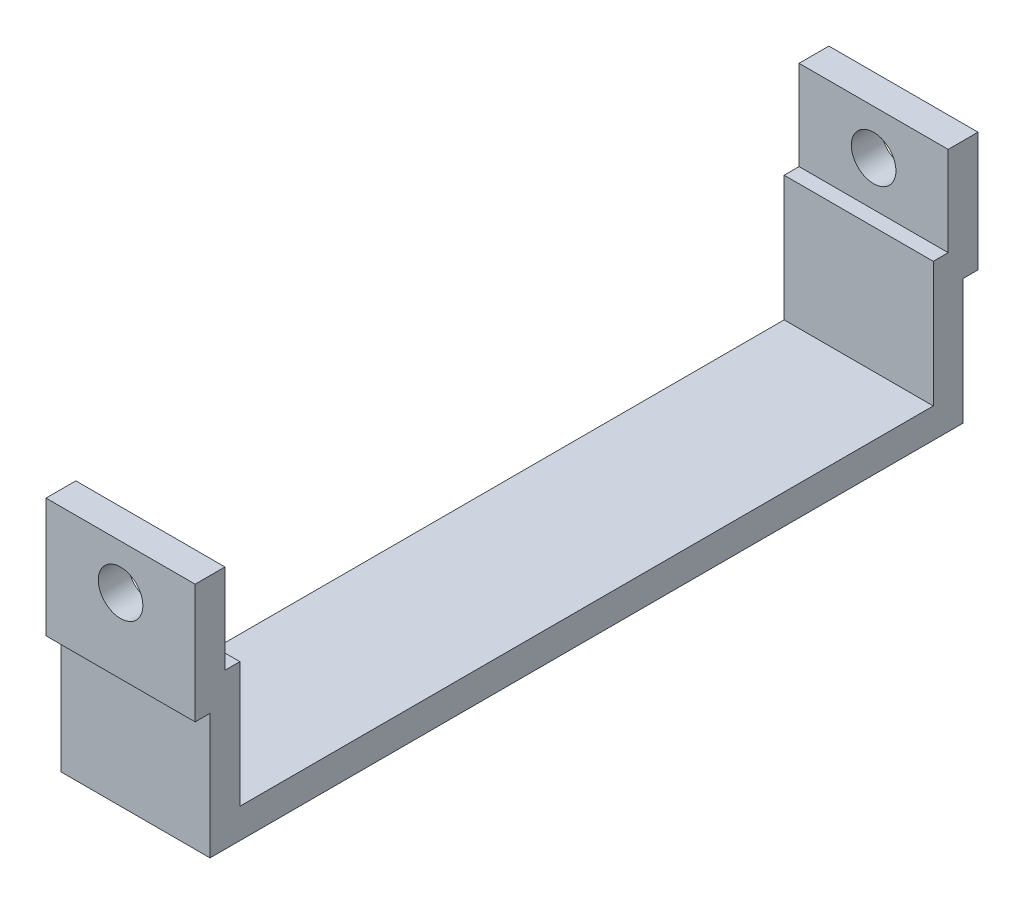
ISO-10303-21;
HEADER;
FILE_DESCRIPTION(('STEP AP214'),'2;1');
FILE_NAME('part.step','',(''),(''),'','','');
FILE_SCHEMA(('AUTOMOTIVE_DESIGN { 1 0 10303 214 1 1 1 1 }'));
ENDSEC;
DATA;
#1=APPLICATION_CONTEXT('core data for automotive mechanical design processes');
#2=APPLICATION_PROTOCOL_DEFINITION('international standard','automotive_design',2000,#1);
#3=PRODUCT_CONTEXT('',#1,'mechanical');
#4=PRODUCT('Part','Part','',(#3));
#5=PRODUCT_RELATED_PRODUCT_CATEGORY('part','',(#4));
#6=PRODUCT_DEFINITION_FORMATION('','',#4);
#7=PRODUCT_DEFINITION_CONTEXT('part definition',#1,'design');
#8=PRODUCT_DEFINITION('design','',#6,#7);
#9=PRODUCT_DEFINITION_SHAPE('','',#8);
#10=(LENGTH_UNIT() NAMED_UNIT(*) SI_UNIT(.MILLI.,.METRE.));
#11=(NAMED_UNIT(*) PLANE_ANGLE_UNIT() SI_UNIT($,.RADIAN.));
#12=(NAMED_UNIT(*) SI_UNIT($,.STERADIAN.) SOLID_ANGLE_UNIT());
#13=UNCERTAINTY_MEASURE_WITH_UNIT(LENGTH_MEASURE(1.E-05),#10,'distance_accuracy_value','');
#14=(GEOMETRIC_REPRESENTATION_CONTEXT(3) GLOBAL_UNCERTAINTY_ASSIGNED_CONTEXT((#13)) GLOBAL_UNIT_ASSIGNED_CONTEXT((#10,
#11,#12)) REPRESENTATION_CONTEXT('',''));
#15=CARTESIAN_POINT('',(0.,0.,0.));
#16=DIRECTION('',(0.,0.,1.));
#17=DIRECTION('',(1.,0.,0.));
#18=AXIS2_PLACEMENT_3D('',#15,#16,#17);
#19=CARTESIAN_POINT('',(12.7,10.668,1.27));
#20=DIRECTION('',(0.,0.,1.));
#21=DIRECTION('',(1.,0.,0.));
#22=AXIS2_PLACEMENT_3D('',#19,#20,#21);
#23=PLANE('',#22);
#24=CARTESIAN_POINT('',(6.35,14.478,1.27));
#25=DIRECTION('',(0.,0.,-1.));
#26=DIRECTION('',(-1.,0.,0.));
#27=AXIS2_PLACEMENT_3D('',#24,#25,#26);
#28=CIRCLE('',#27,1.89864999999999);
#29=CARTESIAN_POINT('',(4.45135000000001,14.478,1.27));
#30=VERTEX_POINT('',#29);
#31=EDGE_CURVE('E317',#30,#30,#28,.T.);
#32=ORIENTED_EDGE('',*,*,#31,.F.);
#33=EDGE_LOOP('',(#32));
#34=FACE_BOUND('',#33,.T.);
#35=DIRECTION('',(0.,1.,0.));
#36=VECTOR('',#35,1.);
#37=CARTESIAN_POINT('',(0.,10.668,1.27));
#38=LINE('',#37,#36);
#39=CARTESIAN_POINT('',(0.,10.668,1.27));
#40=VERTEX_POINT('',#39);
#41=CARTESIAN_POINT('',(0.,18.288,1.27));
#42=VERTEX_POINT('',#41);
#43=EDGE_CURVE('E176',#40,#42,#38,.T.);
#44=ORIENTED_EDGE('',*,*,#43,.T.);
#45=DIRECTION('',(-1.,0.,0.));
#46=VECTOR('',#45,1.);
#47=CARTESIAN_POINT('',(12.7,18.288,1.27));
#48=LINE('',#47,#46);
#49=CARTESIAN_POINT('',(12.7,18.288,1.27));
#50=VERTEX_POINT('',#49);
#51=EDGE_CURVE('E11',#50,#42,#48,.T.);
#52=ORIENTED_EDGE('',*,*,#51,.F.);
#53=DIRECTION('',(0.,1.,0.));
#54=VECTOR('',#53,1.);
#55=CARTESIAN_POINT('',(12.7,10.668,1.27));
#56=LINE('',#55,#54);
#57=CARTESIAN_POINT('',(12.7,10.668,1.27));
#58=VERTEX_POINT('',#57);
#59=EDGE_CURVE('E113',#58,#50,#56,.T.);
#60=ORIENTED_EDGE('',*,*,#59,.F.);
#61=DIRECTION('',(-1.,0.,0.));
#62=VECTOR('',#61,1.);
#63=CARTESIAN_POINT('',(12.7,10.668,1.27));
#64=LINE('',#63,#62);
#65=EDGE_CURVE('E172',#58,#40,#64,.T.);
#66=ORIENTED_EDGE('',*,*,#65,.T.);
#67=EDGE_LOOP('',(#44,#52,#60,#66));
#68=FACE_BOUND('',#67,.T.);
#69=ADVANCED_FACE('F33',(#34,#68),#23,.F.);
#70=CARTESIAN_POINT('',(12.7,18.288,3.81));
#71=DIRECTION('',(0.,1.,0.));
#72=DIRECTION('',(0.,0.,1.));
#73=AXIS2_PLACEMENT_3D('',#70,#71,#72);
#74=PLANE('',#73);
#75=DIRECTION('',(0.,0.,-1.));
#76=VECTOR('',#75,1.);
#77=CARTESIAN_POINT('',(0.,18.288,3.81));
#78=LINE('',#77,#76);
#79=CARTESIAN_POINT('',(0.,18.288,3.81));
#80=VERTEX_POINT('',#79);
#81=EDGE_CURVE('E179',#80,#42,#78,.T.);
#82=ORIENTED_EDGE('',*,*,#81,.F.);
#83=DIRECTION('',(-1.,0.,0.));
#84=VECTOR('',#83,1.);
#85=CARTESIAN_POINT('',(12.7,18.288,3.81));
#86=LINE('',#85,#84);
#87=CARTESIAN_POINT('',(12.7,18.288,3.81));
#88=VERTEX_POINT('',#87);
#89=EDGE_CURVE('E41',#88,#80,#86,.T.);
#90=ORIENTED_EDGE('',*,*,#89,.F.);
#91=DIRECTION('',(0.,0.,-1.));
#92=VECTOR('',#91,1.);
#93=CARTESIAN_POINT('',(12.7,18.288,3.81));
#94=LINE('',#93,#92);
#95=EDGE_CURVE('E262',#88,#50,#94,.T.);
#96=ORIENTED_EDGE('',*,*,#95,.T.);
#97=ORIENTED_EDGE('',*,*,#51,.T.);
#98=EDGE_LOOP('',(#82,#90,#96,#97));
#99=FACE_BOUND('',#98,.T.);
#100=ADVANCED_FACE('F249',(#99),#74,.T.);
#101=CARTESIAN_POINT('',(12.7,10.668,3.81));
#102=DIRECTION('',(0.,0.,1.));
#103=DIRECTION('',(1.,0.,0.));
#104=AXIS2_PLACEMENT_3D('',#101,#102,#103);
#105=PLANE('',#104);
#106=CARTESIAN_POINT('',(6.35,14.478,3.81));
#107=DIRECTION('',(0.,0.,1.));
#108=DIRECTION('',(1.,0.,0.));
#109=AXIS2_PLACEMENT_3D('',#106,#107,#108);
#110=CIRCLE('',#109,1.89864999999999);
#111=CARTESIAN_POINT('',(8.24864999999999,14.478,3.81));
#112=VERTEX_POINT('',#111);
#113=EDGE_CURVE('E180',#112,#112,#110,.T.);
#114=ORIENTED_EDGE('',*,*,#113,.F.);
#115=EDGE_LOOP('',(#114));
#116=FACE_BOUND('',#115,.T.);
#117=DIRECTION('',(0.,1.,0.));
#118=VECTOR('',#117,1.);
#119=CARTESIAN_POINT('',(0.,10.668,3.81));
#120=LINE('',#119,#118);
#121=CARTESIAN_POINT('',(0.,8.128,3.81));
#122=VERTEX_POINT('',#121);
#123=EDGE_CURVE('E183',#122,#80,#120,.T.);
#124=ORIENTED_EDGE('',*,*,#123,.F.);
#125=DIRECTION('',(-1.,0.,0.));
#126=VECTOR('',#125,1.);
#127=CARTESIAN_POINT('',(12.7,8.128,3.81));
#128=LINE('',#127,#126);
#129=CARTESIAN_POINT('',(12.7,8.128,3.81));
#130=VERTEX_POINT('',#129);
#131=EDGE_CURVE('E239',#130,#122,#128,.T.);
#132=ORIENTED_EDGE('',*,*,#131,.F.);
#133=DIRECTION('',(0.,1.,0.));
#134=VECTOR('',#133,1.);
#135=CARTESIAN_POINT('',(12.7,10.668,3.81));
#136=LINE('',#135,#134);
#137=EDGE_CURVE('E246',#130,#88,#136,.T.);
#138=ORIENTED_EDGE('',*,*,#137,.T.);
#139=ORIENTED_EDGE('',*,*,#89,.T.);
#140=EDGE_LOOP('',(#124,#132,#138,#139));
#141=FACE_BOUND('',#140,.T.);
#142=ADVANCED_FACE('F244',(#116,#141),#105,.T.);
#143=CARTESIAN_POINT('',(12.7,8.128,0.));
#144=DIRECTION('',(0.,-1.,0.));
#145=DIRECTION('',(0.,0.,-1.));
#146=AXIS2_PLACEMENT_3D('',#143,#144,#145);
#147=PLANE('',#146);
#148=DIRECTION('',(0.,0.,-1.));
#149=VECTOR('',#148,1.);
#150=CARTESIAN_POINT('',(0.,8.128,0.));
#151=LINE('',#150,#149);
#152=CARTESIAN_POINT('',(0.,8.128,2.54));
#153=VERTEX_POINT('',#152);
#154=EDGE_CURVE('E186',#153,#122,#151,.F.);
#155=ORIENTED_EDGE('',*,*,#154,.F.);
#156=DIRECTION('',(-1.,0.,0.));
#157=VECTOR('',#156,1.);
#158=CARTESIAN_POINT('',(12.7,8.128,2.54));
#159=LINE('',#158,#157);
#160=CARTESIAN_POINT('',(12.7,8.128,2.54));
#161=VERTEX_POINT('',#160);
#162=EDGE_CURVE('E237',#161,#153,#159,.T.);
#163=ORIENTED_EDGE('',*,*,#162,.F.);
#164=DIRECTION('',(0.,0.,-1.));
#165=VECTOR('',#164,1.);
#166=CARTESIAN_POINT('',(12.7,8.128,0.));
#167=LINE('',#166,#165);
#168=EDGE_CURVE('E259',#161,#130,#167,.F.);
#169=ORIENTED_EDGE('',*,*,#168,.T.);
#170=ORIENTED_EDGE('',*,*,#131,.T.);
#171=EDGE_LOOP('',(#155,#163,#169,#170));
#172=FACE_BOUND('',#171,.T.);
#173=ADVANCED_FACE('F256',(#172),#147,.T.);
#174=CARTESIAN_POINT('',(12.7,0.,2.54));
#175=DIRECTION('',(0.,0.,1.));
#176=DIRECTION('',(1.,0.,0.));
#177=AXIS2_PLACEMENT_3D('',#174,#175,#176);
#178=PLANE('',#177);
#179=DIRECTION('',(0.,1.,0.));
#180=VECTOR('',#179,1.);
#181=CARTESIAN_POINT('',(0.,0.,2.54));
#182=LINE('',#181,#180);
#183=CARTESIAN_POINT('',(0.,-2.54,2.54));
#184=VERTEX_POINT('',#183);
#185=EDGE_CURVE('E189',#184,#153,#182,.T.);
#186=ORIENTED_EDGE('',*,*,#185,.F.);
#187=DIRECTION('',(-1.,0.,0.));
#188=VECTOR('',#187,1.);
#189=CARTESIAN_POINT('',(12.7,-2.54,2.54));
#190=LINE('',#189,#188);
#191=CARTESIAN_POINT('',(12.7,-2.54,2.54));
#192=VERTEX_POINT('',#191);
#193=EDGE_CURVE('E235',#192,#184,#190,.T.);
#194=ORIENTED_EDGE('',*,*,#193,.F.);
#195=DIRECTION('',(0.,1.,0.));
#196=VECTOR('',#195,1.);
#197=CARTESIAN_POINT('',(12.7,0.,2.54));
#198=LINE('',#197,#196);
#199=EDGE_CURVE('E264',#192,#161,#198,.T.);
#200=ORIENTED_EDGE('',*,*,#199,.T.);
#201=ORIENTED_EDGE('',*,*,#162,.T.);
#202=EDGE_LOOP('',(#186,#194,#200,#201));
#203=FACE_BOUND('',#202,.T.);
#204=ADVANCED_FACE('F357',(#203),#178,.T.);
#205=CARTESIAN_POINT('',(12.7,-2.54,0.));
#206=DIRECTION('',(0.,-1.,0.));
#207=DIRECTION('',(0.,0.,-1.));
#208=AXIS2_PLACEMENT_3D('',#205,#206,#207);
#209=PLANE('',#208);
#210=DIRECTION('',(0.,0.,-1.));
#211=VECTOR('',#210,1.);
#212=CARTESIAN_POINT('',(0.,-2.54,0.));
#213=LINE('',#212,#211);
#214=CARTESIAN_POINT('',(0.,-2.54,-61.595));
#215=VERTEX_POINT('',#214);
#216=EDGE_CURVE('E192',#215,#184,#213,.F.);
#217=ORIENTED_EDGE('',*,*,#216,.F.);
#218=DIRECTION('',(-1.,0.,0.));
#219=VECTOR('',#218,1.);
#220=CARTESIAN_POINT('',(12.7,-2.54,-61.595));
#221=LINE('',#220,#219);
#222=CARTESIAN_POINT('',(12.7,-2.54,-61.595));
#223=VERTEX_POINT('',#222);
#224=EDGE_CURVE('E233',#223,#215,#221,.T.);
#225=ORIENTED_EDGE('',*,*,#224,.F.);
#226=DIRECTION('',(0.,0.,-1.));
#227=VECTOR('',#226,1.);
#228=CARTESIAN_POINT('',(12.7,-2.54,0.));
#229=LINE('',#228,#227);
#230=EDGE_CURVE('E270',#223,#192,#229,.F.);
#231=ORIENTED_EDGE('',*,*,#230,.T.);
#232=ORIENTED_EDGE('',*,*,#193,.T.);
#233=EDGE_LOOP('',(#217,#225,#231,#232));
#234=FACE_BOUND('',#233,.T.);
#235=ADVANCED_FACE('F355',(#234),#209,.T.);
#236=CARTESIAN_POINT('',(12.7,0.,-61.595));
#237=DIRECTION('',(0.,0.,-1.));
#238=DIRECTION('',(-1.,0.,0.));
#239=AXIS2_PLACEMENT_3D('',#236,#237,#238);
#240=PLANE('',#239);
#241=DIRECTION('',(0.,1.,0.));
#242=VECTOR('',#241,1.);
#243=CARTESIAN_POINT('',(0.,0.,-61.595));
#244=LINE('',#243,#242);
#245=CARTESIAN_POINT('',(0.,8.128,-61.595));
#246=VERTEX_POINT('',#245);
#247=EDGE_CURVE('E195',#246,#215,#244,.F.);
#248=ORIENTED_EDGE('',*,*,#247,.F.);
#249=DIRECTION('',(-1.,0.,0.));
#250=VECTOR('',#249,1.);
#251=CARTESIAN_POINT('',(12.7,8.128,-61.595));
#252=LINE('',#251,#250);
#253=CARTESIAN_POINT('',(12.7,8.128,-61.595));
#254=VERTEX_POINT('',#253);
#255=EDGE_CURVE('E231',#254,#246,#252,.T.);
#256=ORIENTED_EDGE('',*,*,#255,.F.);
#257=DIRECTION('',(0.,1.,0.));
#258=VECTOR('',#257,1.);
#259=CARTESIAN_POINT('',(12.7,0.,-61.595));
#260=LINE('',#259,#258);
#261=EDGE_CURVE('E273',#254,#223,#260,.F.);
#262=ORIENTED_EDGE('',*,*,#261,.T.);
#263=ORIENTED_EDGE('',*,*,#224,.T.);
#264=EDGE_LOOP('',(#248,#256,#262,#263));
#265=FACE_BOUND('',#264,.T.);
#266=ADVANCED_FACE('F351',(#265),#240,.T.);
#267=CARTESIAN_POINT('',(12.7,8.128,-59.055));
#268=DIRECTION('',(0.,-1.,0.));
#269=DIRECTION('',(0.,0.,-1.));
#270=AXIS2_PLACEMENT_3D('',#267,#268,#269);
#271=PLANE('',#270);
#272=DIRECTION('',(0.,0.,-1.));
#273=VECTOR('',#272,1.);
#274=CARTESIAN_POINT('',(0.,8.128,-59.055));
#275=LINE('',#274,#273);
#276=CARTESIAN_POINT('',(0.,8.128,-62.865));
#277=VERTEX_POINT('',#276);
#278=EDGE_CURVE('E198',#277,#246,#275,.F.);
#279=ORIENTED_EDGE('',*,*,#278,.F.);
#280=DIRECTION('',(-1.,0.,0.));
#281=VECTOR('',#280,1.);
#282=CARTESIAN_POINT('',(12.7,8.128,-62.865));
#283=LINE('',#282,#281);
#284=CARTESIAN_POINT('',(12.7,8.128,-62.865));
#285=VERTEX_POINT('',#284);
#286=EDGE_CURVE('E229',#285,#277,#283,.T.);
#287=ORIENTED_EDGE('',*,*,#286,.F.);
#288=DIRECTION('',(0.,0.,-1.));
#289=VECTOR('',#288,1.);
#290=CARTESIAN_POINT('',(12.7,8.128,-59.055));
#291=LINE('',#290,#289);
#292=EDGE_CURVE('E276',#285,#254,#291,.F.);
#293=ORIENTED_EDGE('',*,*,#292,.T.);
#294=ORIENTED_EDGE('',*,*,#255,.T.);
#295=EDGE_LOOP('',(#279,#287,#293,#294));
#296=FACE_BOUND('',#295,.T.);
#297=ADVANCED_FACE('F347',(#296),#271,.T.);
#298=CARTESIAN_POINT('',(12.7,10.668,-62.865));
#299=DIRECTION('',(0.,0.,-1.));
#300=DIRECTION('',(-1.,0.,0.));
#301=AXIS2_PLACEMENT_3D('',#298,#299,#300);
#302=PLANE('',#301);
#303=CARTESIAN_POINT('',(6.35,14.478,-62.865));
#304=DIRECTION('',(0.,0.,-1.));
#305=DIRECTION('',(-1.,0.,0.));
#306=AXIS2_PLACEMENT_3D('',#303,#304,#305);
#307=CIRCLE('',#306,1.89864999999999);
#308=CARTESIAN_POINT('',(4.45135000000001,14.478,-62.865));
#309=VERTEX_POINT('',#308);
#310=EDGE_CURVE('E319',#309,#309,#307,.T.);
#311=ORIENTED_EDGE('',*,*,#310,.F.);
#312=EDGE_LOOP('',(#311));
#313=FACE_BOUND('',#312,.T.);
#314=DIRECTION('',(0.,1.,0.));
#315=VECTOR('',#314,1.);
#316=CARTESIAN_POINT('',(0.,10.668,-62.865));
#317=LINE('',#316,#315);
#318=CARTESIAN_POINT('',(0.,18.288,-62.865));
#319=VERTEX_POINT('',#318);
#320=EDGE_CURVE('E201',#319,#277,#317,.F.);
#321=ORIENTED_EDGE('',*,*,#320,.F.);
#322=DIRECTION('',(-1.,0.,0.));
#323=VECTOR('',#322,1.);
#324=CARTESIAN_POINT('',(12.7,18.288,-62.865));
#325=LINE('',#324,#323);
#326=CARTESIAN_POINT('',(12.7,18.288,-62.865));
#327=VERTEX_POINT('',#326);
#328=EDGE_CURVE('E227',#327,#319,#325,.T.);
#329=ORIENTED_EDGE('',*,*,#328,.F.);
#330=DIRECTION('',(0.,1.,0.));
#331=VECTOR('',#330,1.);
#332=CARTESIAN_POINT('',(12.7,10.668,-62.865));
#333=LINE('',#332,#331);
#334=EDGE_CURVE('E279',#327,#285,#333,.F.);
#335=ORIENTED_EDGE('',*,*,#334,.T.);
#336=ORIENTED_EDGE('',*,*,#286,.T.);
#337=EDGE_LOOP('',(#321,#329,#335,#336));
#338=FACE_BOUND('',#337,.T.);
#339=ADVANCED_FACE('F343',(#313,#338),#302,.T.);
#340=CARTESIAN_POINT('',(12.7,18.288,-60.325));
#341=DIRECTION('',(0.,1.,0.));
#342=DIRECTION('',(0.,0.,1.));
#343=AXIS2_PLACEMENT_3D('',#340,#341,#342);
#344=PLANE('',#343);
#345=DIRECTION('',(0.,0.,-1.));
#346=VECTOR('',#345,1.);
#347=CARTESIAN_POINT('',(0.,18.288,-60.325));
#348=LINE('',#347,#346);
#349=CARTESIAN_POINT('',(0.,18.288,-60.325));
#350=VERTEX_POINT('',#349);
#351=EDGE_CURVE('E204',#350,#319,#348,.T.);
#352=ORIENTED_EDGE('',*,*,#351,.F.);
#353=DIRECTION('',(-1.,0.,0.));
#354=VECTOR('',#353,1.);
#355=CARTESIAN_POINT('',(12.7,18.288,-60.325));
#356=LINE('',#355,#354);
#357=CARTESIAN_POINT('',(12.7,18.288,-60.325));
#358=VERTEX_POINT('',#357);
#359=EDGE_CURVE('E225',#358,#350,#356,.T.);
#360=ORIENTED_EDGE('',*,*,#359,.F.);
#361=DIRECTION('',(0.,0.,-1.));
#362=VECTOR('',#361,1.);
#363=CARTESIAN_POINT('',(12.7,18.288,-60.325));
#364=LINE('',#363,#362);
#365=EDGE_CURVE('E282',#358,#327,#364,.T.);
#366=ORIENTED_EDGE('',*,*,#365,.T.);
#367=ORIENTED_EDGE('',*,*,#328,.T.);
#368=EDGE_LOOP('',(#352,#360,#366,#367));
#369=FACE_BOUND('',#368,.T.);
#370=ADVANCED_FACE('F335',(#369),#344,.T.);
#371=CARTESIAN_POINT('',(12.7,10.668,-60.325));
#372=DIRECTION('',(0.,0.,-1.));
#373=DIRECTION('',(-1.,0.,0.));
#374=AXIS2_PLACEMENT_3D('',#371,#372,#373);
#375=PLANE('',#374);
#376=CARTESIAN_POINT('',(6.35,14.478,-60.325));
#377=DIRECTION('',(0.,0.,1.));
#378=DIRECTION('',(1.,0.,0.));
#379=AXIS2_PLACEMENT_3D('',#376,#377,#378);
#380=CIRCLE('',#379,1.89864999999999);
#381=CARTESIAN_POINT('',(8.24864999999999,14.478,-60.325));
#382=VERTEX_POINT('',#381);
#383=EDGE_CURVE('E324',#382,#382,#380,.T.);
#384=ORIENTED_EDGE('',*,*,#383,.F.);
#385=EDGE_LOOP('',(#384));
#386=FACE_BOUND('',#385,.T.);
#387=DIRECTION('',(0.,-1.,0.));
#388=VECTOR('',#387,1.);
#389=CARTESIAN_POINT('',(0.,10.668,-60.325));
#390=LINE('',#389,#388);
#391=CARTESIAN_POINT('',(0.,10.668,-60.325));
#392=VERTEX_POINT('',#391);
#393=EDGE_CURVE('E207',#350,#392,#390,.T.);
#394=ORIENTED_EDGE('',*,*,#393,.T.);
#395=DIRECTION('',(-1.,0.,0.));
#396=VECTOR('',#395,1.);
#397=CARTESIAN_POINT('',(12.7,10.668,-60.325));
#398=LINE('',#397,#396);
#399=CARTESIAN_POINT('',(12.7,10.668,-60.325));
#400=VERTEX_POINT('',#399);
#401=EDGE_CURVE('E222',#400,#392,#398,.T.);
#402=ORIENTED_EDGE('',*,*,#401,.F.);
#403=DIRECTION('',(0.,-1.,0.));
#404=VECTOR('',#403,1.);
#405=CARTESIAN_POINT('',(12.7,10.668,-60.325));
#406=LINE('',#405,#404);
#407=EDGE_CURVE('E285',#358,#400,#406,.T.);
#408=ORIENTED_EDGE('',*,*,#407,.F.);
#409=ORIENTED_EDGE('',*,*,#359,.T.);
#410=EDGE_LOOP('',(#394,#402,#408,#409));
#411=FACE_BOUND('',#410,.T.);
#412=ADVANCED_FACE('F332',(#386,#411),#375,.F.);
#413=CARTESIAN_POINT('',(12.7,10.668,-59.055));
#414=DIRECTION('',(0.,-1.,0.));
#415=DIRECTION('',(0.,0.,-1.));
#416=AXIS2_PLACEMENT_3D('',#413,#414,#415);
#417=PLANE('',#416);
#418=DIRECTION('',(0.,0.,1.));
#419=VECTOR('',#418,1.);
#420=CARTESIAN_POINT('',(0.,10.668,-59.055));
#421=LINE('',#420,#419);
#422=CARTESIAN_POINT('',(0.,10.668,-59.055));
#423=VERTEX_POINT('',#422);
#424=EDGE_CURVE('E209',#392,#423,#421,.T.);
#425=ORIENTED_EDGE('',*,*,#424,.T.);
#426=DIRECTION('',(-1.,0.,0.));
#427=VECTOR('',#426,1.);
#428=CARTESIAN_POINT('',(12.7,10.668,-59.055));
#429=LINE('',#428,#427);
#430=CARTESIAN_POINT('',(12.7,10.668,-59.055));
#431=VERTEX_POINT('',#430);
#432=EDGE_CURVE('E219',#431,#423,#429,.T.);
#433=ORIENTED_EDGE('',*,*,#432,.F.);
#434=DIRECTION('',(0.,0.,1.));
#435=VECTOR('',#434,1.);
#436=CARTESIAN_POINT('',(12.7,10.668,-59.055));
#437=LINE('',#436,#435);
#438=EDGE_CURVE('E287',#400,#431,#437,.T.);
#439=ORIENTED_EDGE('',*,*,#438,.F.);
#440=ORIENTED_EDGE('',*,*,#401,.T.);
#441=EDGE_LOOP('',(#425,#433,#439,#440));
#442=FACE_BOUND('',#441,.T.);
#443=ADVANCED_FACE('F294',(#442),#417,.F.);
#444=CARTESIAN_POINT('',(12.7,0.,-59.055));
#445=DIRECTION('',(0.,0.,-1.));
#446=DIRECTION('',(-1.,0.,0.));
#447=AXIS2_PLACEMENT_3D('',#444,#445,#446);
#448=PLANE('',#447);
#449=DIRECTION('',(0.,-1.,0.));
#450=VECTOR('',#449,1.);
#451=CARTESIAN_POINT('',(0.,0.,-59.055));
#452=LINE('',#451,#450);
#453=CARTESIAN_POINT('',(0.,0.,-59.055));
#454=VERTEX_POINT('',#453);
#455=EDGE_CURVE('E211',#423,#454,#452,.T.);
#456=ORIENTED_EDGE('',*,*,#455,.T.);
#457=DIRECTION('',(-1.,0.,0.));
#458=VECTOR('',#457,1.);
#459=CARTESIAN_POINT('',(12.7,0.,-59.055));
#460=LINE('',#459,#458);
#461=CARTESIAN_POINT('',(12.7,0.,-59.055));
#462=VERTEX_POINT('',#461);
#463=EDGE_CURVE('E167',#462,#454,#460,.T.);
#464=ORIENTED_EDGE('',*,*,#463,.F.);
#465=DIRECTION('',(0.,-1.,0.));
#466=VECTOR('',#465,1.);
#467=CARTESIAN_POINT('',(12.7,0.,-59.055));
#468=LINE('',#467,#466);
#469=EDGE_CURVE('E158',#431,#462,#468,.T.);
#470=ORIENTED_EDGE('',*,*,#469,.F.);
#471=ORIENTED_EDGE('',*,*,#432,.T.);
#472=EDGE_LOOP('',(#456,#464,#470,#471));
#473=FACE_BOUND('',#472,.T.);
#474=ADVANCED_FACE('F298',(#473),#448,.F.);
#475=CARTESIAN_POINT('',(12.7,0.,0.));
#476=DIRECTION('',(0.,-1.,0.));
#477=DIRECTION('',(0.,0.,-1.));
#478=AXIS2_PLACEMENT_3D('',#475,#476,#477);
#479=PLANE('',#478);
#480=DIRECTION('',(0.,0.,1.));
#481=VECTOR('',#480,1.);
#482=CARTESIAN_POINT('',(0.,0.,0.));
#483=LINE('',#482,#481);
#484=CARTESIAN_POINT('',(0.,0.,0.));
#485=VERTEX_POINT('',#484);
#486=EDGE_CURVE('E166',#454,#485,#483,.T.);
#487=ORIENTED_EDGE('',*,*,#486,.T.);
#488=DIRECTION('',(-1.,0.,0.));
#489=VECTOR('',#488,1.);
#490=CARTESIAN_POINT('',(12.7,0.,0.));
#491=LINE('',#490,#489);
#492=CARTESIAN_POINT('',(12.7,0.,0.));
#493=VERTEX_POINT('',#492);
#494=EDGE_CURVE('E163',#493,#485,#491,.T.);
#495=ORIENTED_EDGE('',*,*,#494,.F.);
#496=DIRECTION('',(0.,0.,1.));
#497=VECTOR('',#496,1.);
#498=CARTESIAN_POINT('',(12.7,0.,0.));
#499=LINE('',#498,#497);
#500=EDGE_CURVE('E152',#462,#493,#499,.T.);
#501=ORIENTED_EDGE('',*,*,#500,.F.);
#502=ORIENTED_EDGE('',*,*,#463,.T.);
#503=EDGE_LOOP('',(#487,#495,#501,#502));
#504=FACE_BOUND('',#503,.T.);
#505=ADVANCED_FACE('F164',(#504),#479,.F.);
#506=CARTESIAN_POINT('',(12.7,0.,0.));
#507=DIRECTION('',(0.,0.,1.));
#508=DIRECTION('',(1.,0.,0.));
#509=AXIS2_PLACEMENT_3D('',#506,#507,#508);
#510=PLANE('',#509);
#511=DIRECTION('',(0.,1.,0.));
#512=VECTOR('',#511,1.);
#513=CARTESIAN_POINT('',(0.,0.,0.));
#514=LINE('',#513,#512);
#515=CARTESIAN_POINT('',(0.,10.668,0.));
#516=VERTEX_POINT('',#515);
#517=EDGE_CURVE('E101',#485,#516,#514,.T.);
#518=ORIENTED_EDGE('',*,*,#517,.T.);
#519=DIRECTION('',(-1.,0.,0.));
#520=VECTOR('',#519,1.);
#521=CARTESIAN_POINT('',(12.7,10.668,0.));
#522=LINE('',#521,#520);
#523=CARTESIAN_POINT('',(12.7,10.668,0.));
#524=VERTEX_POINT('',#523);
#525=EDGE_CURVE('E168',#524,#516,#522,.T.);
#526=ORIENTED_EDGE('',*,*,#525,.F.);
#527=DIRECTION('',(0.,1.,0.));
#528=VECTOR('',#527,1.);
#529=CARTESIAN_POINT('',(12.7,0.,0.));
#530=LINE('',#529,#528);
#531=EDGE_CURVE('E156',#493,#524,#530,.T.);
#532=ORIENTED_EDGE('',*,*,#531,.F.);
#533=ORIENTED_EDGE('',*,*,#494,.T.);
#534=EDGE_LOOP('',(#518,#526,#532,#533));
#535=FACE_BOUND('',#534,.T.);
#536=ADVANCED_FACE('F170',(#535),#510,.F.);
#537=CARTESIAN_POINT('',(12.7,10.668,0.));
#538=DIRECTION('',(0.,-1.,0.));
#539=DIRECTION('',(0.,0.,-1.));
#540=AXIS2_PLACEMENT_3D('',#537,#538,#539);
#541=PLANE('',#540);
#542=DIRECTION('',(0.,0.,1.));
#543=VECTOR('',#542,1.);
#544=CARTESIAN_POINT('',(0.,10.668,0.));
#545=LINE('',#544,#543);
#546=EDGE_CURVE('E107',#516,#40,#545,.T.);
#547=ORIENTED_EDGE('',*,*,#546,.T.);
#548=ORIENTED_EDGE('',*,*,#65,.F.);
#549=DIRECTION('',(0.,0.,1.));
#550=VECTOR('',#549,1.);
#551=CARTESIAN_POINT('',(12.7,10.668,0.));
#552=LINE('',#551,#550);
#553=EDGE_CURVE('E49',#524,#58,#552,.T.);
#554=ORIENTED_EDGE('',*,*,#553,.F.);
#555=ORIENTED_EDGE('',*,*,#525,.T.);
#556=EDGE_LOOP('',(#547,#548,#554,#555));
#557=FACE_BOUND('',#556,.T.);
#558=ADVANCED_FACE('F300',(#557),#541,.F.);
#559=CARTESIAN_POINT('',(12.7,0.,0.));
#560=DIRECTION('',(-1.,0.,0.));
#561=DIRECTION('',(0.,0.,1.));
#562=AXIS2_PLACEMENT_3D('',#559,#560,#561);
#563=PLANE('',#562);
#564=ORIENTED_EDGE('',*,*,#59,.T.);
#565=ORIENTED_EDGE('',*,*,#95,.F.);
#566=ORIENTED_EDGE('',*,*,#137,.F.);
#567=ORIENTED_EDGE('',*,*,#168,.F.);
#568=ORIENTED_EDGE('',*,*,#199,.F.);
#569=ORIENTED_EDGE('',*,*,#230,.F.);
#570=ORIENTED_EDGE('',*,*,#261,.F.);
#571=ORIENTED_EDGE('',*,*,#292,.F.);
#572=ORIENTED_EDGE('',*,*,#334,.F.);
#573=ORIENTED_EDGE('',*,*,#365,.F.);
#574=ORIENTED_EDGE('',*,*,#407,.T.);
#575=ORIENTED_EDGE('',*,*,#438,.T.);
#576=ORIENTED_EDGE('',*,*,#469,.T.);
#577=ORIENTED_EDGE('',*,*,#500,.T.);
#578=ORIENTED_EDGE('',*,*,#531,.T.);
#579=ORIENTED_EDGE('',*,*,#553,.T.);
#580=EDGE_LOOP('',(#564,#565,#566,#567,#568,#569,#570,#571,#572,#573,#574,#575,#576,#577,#578,#579));
#581=FACE_BOUND('',#580,.T.);
#582=ADVANCED_FACE('F154',(#581),#563,.F.);
#583=CARTESIAN_POINT('',(0.,0.,0.));
#584=DIRECTION('',(-1.,0.,0.));
#585=DIRECTION('',(0.,0.,1.));
#586=AXIS2_PLACEMENT_3D('',#583,#584,#585);
#587=PLANE('',#586);
#588=ORIENTED_EDGE('',*,*,#43,.F.);
#589=ORIENTED_EDGE('',*,*,#546,.F.);
#590=ORIENTED_EDGE('',*,*,#517,.F.);
#591=ORIENTED_EDGE('',*,*,#486,.F.);
#592=ORIENTED_EDGE('',*,*,#455,.F.);
#593=ORIENTED_EDGE('',*,*,#424,.F.);
#594=ORIENTED_EDGE('',*,*,#393,.F.);
#595=ORIENTED_EDGE('',*,*,#351,.T.);
#596=ORIENTED_EDGE('',*,*,#320,.T.);
#597=ORIENTED_EDGE('',*,*,#278,.T.);
#598=ORIENTED_EDGE('',*,*,#247,.T.);
#599=ORIENTED_EDGE('',*,*,#216,.T.);
#600=ORIENTED_EDGE('',*,*,#185,.T.);
#601=ORIENTED_EDGE('',*,*,#154,.T.);
#602=ORIENTED_EDGE('',*,*,#123,.T.);
#603=ORIENTED_EDGE('',*,*,#81,.T.);
#604=EDGE_LOOP('',(#588,#589,#590,#591,#592,#593,#594,#595,#596,#597,#598,#599,#600,#601,#602,#603));
#605=FACE_BOUND('',#604,.T.);
#606=ADVANCED_FACE('F252',(#605),#587,.T.);
#607=CARTESIAN_POINT('',(6.35,14.478,1.27));
#608=DIRECTION('',(0.,0.,-1.));
#609=DIRECTION('',(-1.,0.,0.));
#610=AXIS2_PLACEMENT_3D('',#607,#608,#609);
#611=CYLINDRICAL_SURFACE('',#610,1.89864999999999);
#612=ORIENTED_EDGE('',*,*,#113,.T.);
#613=EDGE_LOOP('',(#612));
#614=FACE_BOUND('',#613,.T.);
#615=ORIENTED_EDGE('',*,*,#31,.T.);
#616=EDGE_LOOP('',(#615));
#617=FACE_BOUND('',#616,.T.);
#618=ADVANCED_FACE('F374',(#614,#617),#611,.F.);
#619=CARTESIAN_POINT('',(6.35,14.478,-60.325));
#620=DIRECTION('',(0.,0.,1.));
#621=DIRECTION('',(1.,0.,0.));
#622=AXIS2_PLACEMENT_3D('',#619,#620,#621);
#623=CYLINDRICAL_SURFACE('',#622,1.89864999999999);
#624=ORIENTED_EDGE('',*,*,#310,.T.);
#625=EDGE_LOOP('',(#624));
#626=FACE_BOUND('',#625,.T.);
#627=ORIENTED_EDGE('',*,*,#383,.T.);
#628=EDGE_LOOP('',(#627));
#629=FACE_BOUND('',#628,.T.);
#630=ADVANCED_FACE('F330',(#626,#629),#623,.F.);
#631=CLOSED_SHELL('',(#69,#100,#142,#173,#204,#235,#266,#297,#339,#370,#412,#443,#474,#505,#536,
#558,#582,#606,#618,#630));
#632=MANIFOLD_SOLID_BREP('B2',#631);
#633=ADVANCED_BREP_SHAPE_REPRESENTATION('',(#18,#632),#14);
#634=SHAPE_DEFINITION_REPRESENTATION(#9,#633);
ENDSEC;
END-ISO-10303-21;
